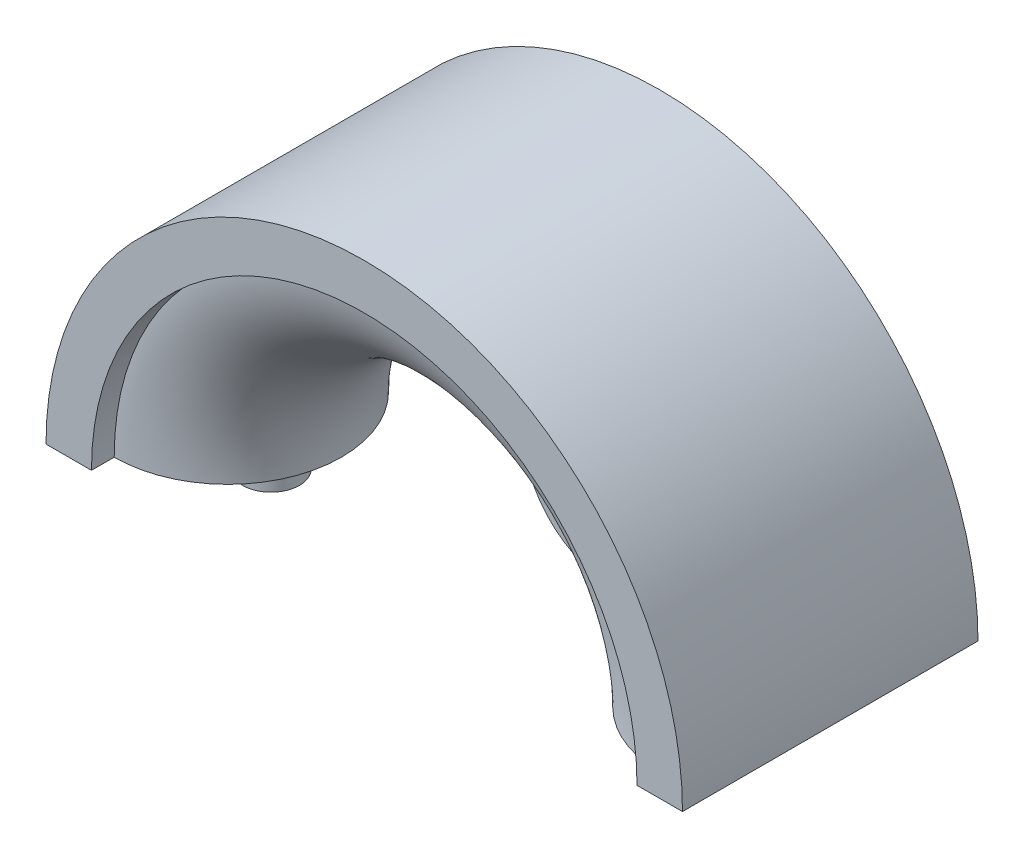
ISO-10303-21;
HEADER;
FILE_DESCRIPTION(('STEP AP214'),'2;1');
FILE_NAME('part.step','',(''),(''),'','','');
FILE_SCHEMA(('AUTOMOTIVE_DESIGN { 1 0 10303 214 1 1 1 1 }'));
ENDSEC;
DATA;
#1=APPLICATION_CONTEXT('core data for automotive mechanical design processes');
#2=APPLICATION_PROTOCOL_DEFINITION('international standard','automotive_design',2000,#1);
#3=PRODUCT_CONTEXT('',#1,'mechanical');
#4=PRODUCT('Part','Part','',(#3));
#5=PRODUCT_RELATED_PRODUCT_CATEGORY('part','',(#4));
#6=PRODUCT_DEFINITION_FORMATION('','',#4);
#7=PRODUCT_DEFINITION_CONTEXT('part definition',#1,'design');
#8=PRODUCT_DEFINITION('design','',#6,#7);
#9=PRODUCT_DEFINITION_SHAPE('','',#8);
#10=(LENGTH_UNIT() NAMED_UNIT(*) SI_UNIT(.MILLI.,.METRE.));
#11=(NAMED_UNIT(*) PLANE_ANGLE_UNIT() SI_UNIT($,.RADIAN.));
#12=(NAMED_UNIT(*) SI_UNIT($,.STERADIAN.) SOLID_ANGLE_UNIT());
#13=UNCERTAINTY_MEASURE_WITH_UNIT(LENGTH_MEASURE(1.E-05),#10,'distance_accuracy_value','');
#14=(GEOMETRIC_REPRESENTATION_CONTEXT(3) GLOBAL_UNCERTAINTY_ASSIGNED_CONTEXT((#13)) GLOBAL_UNIT_ASSIGNED_CONTEXT((#10,
#11,#12)) REPRESENTATION_CONTEXT('',''));
#15=CARTESIAN_POINT('',(0.,0.,0.));
#16=DIRECTION('',(0.,0.,1.));
#17=DIRECTION('',(1.,0.,0.));
#18=AXIS2_PLACEMENT_3D('',#15,#16,#17);
#19=CARTESIAN_POINT('',(0.,0.,0.));
#20=DIRECTION('',(0.,1.,0.));
#21=DIRECTION('',(0.,0.,1.));
#22=AXIS2_PLACEMENT_3D('',#19,#20,#21);
#23=PLANE('',#22);
#24=CARTESIAN_POINT('',(10.1,0.,5.99999999999991));
#25=DIRECTION('',(0.,1.,0.));
#26=DIRECTION('',(0.,0.,1.));
#27=AXIS2_PLACEMENT_3D('',#24,#25,#26);
#28=CIRCLE('',#27,1.25);
#29=CARTESIAN_POINT('',(10.1,0.,7.24999999999991));
#30=VERTEX_POINT('',#29);
#31=EDGE_CURVE('E168',#30,#30,#28,.F.);
#32=ORIENTED_EDGE('',*,*,#31,.F.);
#33=EDGE_LOOP('',(#32));
#34=FACE_BOUND('',#33,.T.);
#35=DIRECTION('',(-1.,0.,0.));
#36=VECTOR('',#35,1.);
#37=CARTESIAN_POINT('',(0.,0.,0.));
#38=LINE('',#37,#36);
#39=CARTESIAN_POINT('',(12.,0.,0.));
#40=VERTEX_POINT('',#39);
#41=CARTESIAN_POINT('',(4.,0.,0.));
#42=VERTEX_POINT('',#41);
#43=EDGE_CURVE('E117',#40,#42,#38,.T.);
#44=ORIENTED_EDGE('',*,*,#43,.T.);
#45=DIRECTION('',(0.,0.,-1.));
#46=VECTOR('',#45,1.);
#47=CARTESIAN_POINT('',(4.,0.,1.));
#48=LINE('',#47,#46);
#49=CARTESIAN_POINT('',(4.,0.,-1.));
#50=VERTEX_POINT('',#49);
#51=EDGE_CURVE('E11',#42,#50,#48,.T.);
#52=ORIENTED_EDGE('',*,*,#51,.T.);
#53=DIRECTION('',(1.,0.,0.));
#54=VECTOR('',#53,1.);
#55=CARTESIAN_POINT('',(-12.,0.,-1.));
#56=LINE('',#55,#54);
#57=CARTESIAN_POINT('',(14.,0.,-1.));
#58=VERTEX_POINT('',#57);
#59=EDGE_CURVE('E104',#50,#58,#56,.T.);
#60=ORIENTED_EDGE('',*,*,#59,.T.);
#61=DIRECTION('',(0.,0.,-1.));
#62=VECTOR('',#61,1.);
#63=CARTESIAN_POINT('',(14.,0.,0.));
#64=LINE('',#63,#62);
#65=CARTESIAN_POINT('',(14.,0.,12.));
#66=VERTEX_POINT('',#65);
#67=EDGE_CURVE('E114',#58,#66,#64,.F.);
#68=ORIENTED_EDGE('',*,*,#67,.T.);
#69=DIRECTION('',(-1.,0.,0.));
#70=VECTOR('',#69,1.);
#71=CARTESIAN_POINT('',(-12.,0.,12.));
#72=LINE('',#71,#70);
#73=CARTESIAN_POINT('',(12.,0.,12.));
#74=VERTEX_POINT('',#73);
#75=EDGE_CURVE('E146',#66,#74,#72,.T.);
#76=ORIENTED_EDGE('',*,*,#75,.T.);
#77=DIRECTION('',(0.,0.,-1.));
#78=VECTOR('',#77,1.);
#79=CARTESIAN_POINT('',(12.,0.,0.));
#80=LINE('',#79,#78);
#81=CARTESIAN_POINT('',(12.0000000000001,0.,10.9999999999999));
#82=VERTEX_POINT('',#81);
#83=EDGE_CURVE('E142',#74,#82,#80,.T.);
#84=ORIENTED_EDGE('',*,*,#83,.T.);
#85=CARTESIAN_POINT('',(12.,0.,5.99999999999991));
#86=DIRECTION('',(0.,1.,0.));
#87=DIRECTION('',(0.,0.,1.));
#88=AXIS2_PLACEMENT_3D('',#85,#86,#87);
#89=CIRCLE('',#88,5.);
#90=CARTESIAN_POINT('',(12.,0.,0.999999999999957));
#91=VERTEX_POINT('',#90);
#92=EDGE_CURVE('E136',#82,#91,#89,.F.);
#93=ORIENTED_EDGE('',*,*,#92,.T.);
#94=DIRECTION('',(0.,0.,-1.));
#95=VECTOR('',#94,1.);
#96=CARTESIAN_POINT('',(12.,0.,0.));
#97=LINE('',#96,#95);
#98=EDGE_CURVE('E134',#91,#40,#97,.T.);
#99=ORIENTED_EDGE('',*,*,#98,.T.);
#100=EDGE_LOOP('',(#44,#52,#60,#68,#76,#84,#93,#99));
#101=FACE_BOUND('',#100,.T.);
#102=ADVANCED_FACE('F39',(#34,#101),#23,.F.);
#103=CARTESIAN_POINT('',(0.,0.,6.));
#104=DIRECTION('',(0.,0.,1.));
#105=DIRECTION('',(0.,-1.,0.));
#106=AXIS2_PLACEMENT_3D('',#103,#104,#105);
#107=TOROIDAL_SURFACE('',#106,12.,5.);
#108=CARTESIAN_POINT('',(-12.,0.,6.00000000000008));
#109=DIRECTION('',(0.,1.,0.));
#110=DIRECTION('',(0.,0.,1.));
#111=AXIS2_PLACEMENT_3D('',#108,#109,#110);
#112=CIRCLE('',#111,5.);
#113=CARTESIAN_POINT('',(-12.,0.,0.999999999999957));
#114=VERTEX_POINT('',#113);
#115=CARTESIAN_POINT('',(-11.9999999999999,0.,11.0000000000001));
#116=VERTEX_POINT('',#115);
#117=EDGE_CURVE('E138',#114,#116,#112,.F.);
#118=ORIENTED_EDGE('',*,*,#117,.F.);
#119=CARTESIAN_POINT('',(0.,0.,0.999999999999999));
#120=DIRECTION('',(0.,0.,1.));
#121=DIRECTION('',(0.,-1.,0.));
#122=AXIS2_PLACEMENT_3D('',#119,#120,#121);
#123=CIRCLE('',#122,12.);
#124=EDGE_CURVE('E160',#91,#114,#123,.T.);
#125=ORIENTED_EDGE('',*,*,#124,.F.);
#126=ORIENTED_EDGE('',*,*,#92,.F.);
#127=CARTESIAN_POINT('',(0.,0.,11.));
#128=DIRECTION('',(0.,0.,-1.));
#129=DIRECTION('',(-1.,0.,0.));
#130=AXIS2_PLACEMENT_3D('',#127,#128,#129);
#131=CIRCLE('',#130,12.);
#132=EDGE_CURVE('E157',#116,#82,#131,.T.);
#133=ORIENTED_EDGE('',*,*,#132,.F.);
#134=EDGE_LOOP('',(#118,#125,#126,#133));
#135=FACE_BOUND('',#134,.T.);
#136=ADVANCED_FACE('F41',(#135),#107,.T.);
#137=CARTESIAN_POINT('',(0.,0.,0.));
#138=DIRECTION('',(0.,0.,-1.));
#139=DIRECTION('',(-1.,0.,0.));
#140=AXIS2_PLACEMENT_3D('',#137,#138,#139);
#141=CYLINDRICAL_SURFACE('',#140,12.);
#142=ORIENTED_EDGE('',*,*,#83,.F.);
#143=CARTESIAN_POINT('',(0.,0.,12.));
#144=DIRECTION('',(0.,0.,-1.));
#145=DIRECTION('',(-1.,0.,0.));
#146=AXIS2_PLACEMENT_3D('',#143,#144,#145);
#147=CIRCLE('',#146,12.);
#148=CARTESIAN_POINT('',(-12.,0.,12.));
#149=VERTEX_POINT('',#148);
#150=EDGE_CURVE('E154',#149,#74,#147,.T.);
#151=ORIENTED_EDGE('',*,*,#150,.F.);
#152=DIRECTION('',(0.,0.,-1.));
#153=VECTOR('',#152,1.);
#154=CARTESIAN_POINT('',(-12.,0.,0.));
#155=LINE('',#154,#153);
#156=EDGE_CURVE('E140',#116,#149,#155,.F.);
#157=ORIENTED_EDGE('',*,*,#156,.F.);
#158=ORIENTED_EDGE('',*,*,#132,.T.);
#159=EDGE_LOOP('',(#142,#151,#157,#158));
#160=FACE_BOUND('',#159,.T.);
#161=ADVANCED_FACE('F194',(#160),#141,.F.);
#162=ORIENTED_EDGE('',*,*,#98,.F.);
#163=ORIENTED_EDGE('',*,*,#124,.T.);
#164=DIRECTION('',(0.,0.,-1.));
#165=VECTOR('',#164,1.);
#166=CARTESIAN_POINT('',(-12.,0.,0.));
#167=LINE('',#166,#165);
#168=CARTESIAN_POINT('',(-12.,0.,0.));
#169=VERTEX_POINT('',#168);
#170=EDGE_CURVE('E130',#169,#114,#167,.F.);
#171=ORIENTED_EDGE('',*,*,#170,.F.);
#172=CARTESIAN_POINT('',(0.,0.,0.));
#173=DIRECTION('',(0.,0.,1.));
#174=DIRECTION('',(1.,0.,0.));
#175=AXIS2_PLACEMENT_3D('',#172,#173,#174);
#176=CIRCLE('',#175,12.);
#177=EDGE_CURVE('E163',#40,#169,#176,.T.);
#178=ORIENTED_EDGE('',*,*,#177,.F.);
#179=EDGE_LOOP('',(#162,#163,#171,#178));
#180=FACE_BOUND('',#179,.T.);
#181=ADVANCED_FACE('F203',(#180),#141,.F.);
#182=CARTESIAN_POINT('',(-12.,0.,12.));
#183=DIRECTION('',(0.,0.,1.));
#184=DIRECTION('',(1.,0.,0.));
#185=AXIS2_PLACEMENT_3D('',#182,#183,#184);
#186=PLANE('',#185);
#187=ORIENTED_EDGE('',*,*,#75,.F.);
#188=CARTESIAN_POINT('',(0.,0.,12.));
#189=DIRECTION('',(0.,0.,-1.));
#190=DIRECTION('',(-1.,0.,0.));
#191=AXIS2_PLACEMENT_3D('',#188,#189,#190);
#192=CIRCLE('',#191,14.);
#193=CARTESIAN_POINT('',(-14.,0.,12.));
#194=VERTEX_POINT('',#193);
#195=EDGE_CURVE('E151',#194,#66,#192,.T.);
#196=ORIENTED_EDGE('',*,*,#195,.F.);
#197=EDGE_CURVE('E144',#149,#194,#72,.T.);
#198=ORIENTED_EDGE('',*,*,#197,.F.);
#199=ORIENTED_EDGE('',*,*,#150,.T.);
#200=EDGE_LOOP('',(#187,#196,#198,#199));
#201=FACE_BOUND('',#200,.T.);
#202=ADVANCED_FACE('F189',(#201),#186,.T.);
#203=CARTESIAN_POINT('',(0.,0.,0.));
#204=DIRECTION('',(0.,0.,-1.));
#205=DIRECTION('',(-1.,0.,0.));
#206=AXIS2_PLACEMENT_3D('',#203,#204,#205);
#207=CYLINDRICAL_SURFACE('',#206,14.);
#208=ORIENTED_EDGE('',*,*,#67,.F.);
#209=CARTESIAN_POINT('',(0.,0.,-1.));
#210=DIRECTION('',(0.,0.,-1.));
#211=DIRECTION('',(-1.,0.,0.));
#212=AXIS2_PLACEMENT_3D('',#209,#210,#211);
#213=CIRCLE('',#212,14.);
#214=CARTESIAN_POINT('',(-14.,0.,-1.));
#215=VERTEX_POINT('',#214);
#216=EDGE_CURVE('E110',#215,#58,#213,.T.);
#217=ORIENTED_EDGE('',*,*,#216,.F.);
#218=DIRECTION('',(0.,0.,-1.));
#219=VECTOR('',#218,1.);
#220=CARTESIAN_POINT('',(-14.,0.,0.));
#221=LINE('',#220,#219);
#222=EDGE_CURVE('E147',#194,#215,#221,.T.);
#223=ORIENTED_EDGE('',*,*,#222,.F.);
#224=ORIENTED_EDGE('',*,*,#195,.T.);
#225=EDGE_LOOP('',(#208,#217,#223,#224));
#226=FACE_BOUND('',#225,.T.);
#227=ADVANCED_FACE('F184',(#226),#207,.T.);
#228=CARTESIAN_POINT('',(-12.,0.,-1.));
#229=DIRECTION('',(0.,0.,-1.));
#230=DIRECTION('',(-1.,0.,0.));
#231=AXIS2_PLACEMENT_3D('',#228,#229,#230);
#232=PLANE('',#231);
#233=ORIENTED_EDGE('',*,*,#59,.F.);
#234=CARTESIAN_POINT('',(0.,0.,-1.));
#235=DIRECTION('',(0.,0.,-1.));
#236=DIRECTION('',(-1.,0.,0.));
#237=AXIS2_PLACEMENT_3D('',#234,#235,#236);
#238=CIRCLE('',#237,4.);
#239=CARTESIAN_POINT('',(-4.,0.,-1.));
#240=VERTEX_POINT('',#239);
#241=EDGE_CURVE('E108',#50,#240,#238,.T.);
#242=ORIENTED_EDGE('',*,*,#241,.T.);
#243=EDGE_CURVE('E113',#215,#240,#56,.T.);
#244=ORIENTED_EDGE('',*,*,#243,.F.);
#245=ORIENTED_EDGE('',*,*,#216,.T.);
#246=EDGE_LOOP('',(#233,#242,#244,#245));
#247=FACE_BOUND('',#246,.T.);
#248=ADVANCED_FACE('F105',(#247),#232,.T.);
#249=CARTESIAN_POINT('',(0.,0.,0.));
#250=DIRECTION('',(0.,0.,1.));
#251=DIRECTION('',(1.,0.,0.));
#252=AXIS2_PLACEMENT_3D('',#249,#250,#251);
#253=PLANE('',#252);
#254=CARTESIAN_POINT('',(0.,0.,0.));
#255=DIRECTION('',(0.,0.,1.));
#256=DIRECTION('',(1.,0.,0.));
#257=AXIS2_PLACEMENT_3D('',#254,#255,#256);
#258=CIRCLE('',#257,4.);
#259=CARTESIAN_POINT('',(-4.,0.,0.));
#260=VERTEX_POINT('',#259);
#261=EDGE_CURVE('E60',#42,#260,#258,.T.);
#262=ORIENTED_EDGE('',*,*,#261,.F.);
#263=ORIENTED_EDGE('',*,*,#43,.F.);
#264=ORIENTED_EDGE('',*,*,#177,.T.);
#265=EDGE_CURVE('E166',#260,#169,#38,.T.);
#266=ORIENTED_EDGE('',*,*,#265,.F.);
#267=EDGE_LOOP('',(#262,#263,#264,#266));
#268=FACE_BOUND('',#267,.T.);
#269=ADVANCED_FACE('F180',(#268),#253,.T.);
#270=CARTESIAN_POINT('',(-10.1,0.,5.99999999999991));
#271=DIRECTION('',(0.,1.,0.));
#272=DIRECTION('',(0.,0.,1.));
#273=AXIS2_PLACEMENT_3D('',#270,#271,#272);
#274=CIRCLE('',#273,1.25);
#275=CARTESIAN_POINT('',(-10.1,0.,7.24999999999991));
#276=VERTEX_POINT('',#275);
#277=EDGE_CURVE('E171',#276,#276,#274,.F.);
#278=ORIENTED_EDGE('',*,*,#277,.F.);
#279=EDGE_LOOP('',(#278));
#280=FACE_BOUND('',#279,.T.);
#281=ORIENTED_EDGE('',*,*,#243,.T.);
#282=DIRECTION('',(0.,0.,-1.));
#283=VECTOR('',#282,1.);
#284=CARTESIAN_POINT('',(-4.,0.,1.));
#285=LINE('',#284,#283);
#286=EDGE_CURVE('E47',#240,#260,#285,.F.);
#287=ORIENTED_EDGE('',*,*,#286,.T.);
#288=ORIENTED_EDGE('',*,*,#265,.T.);
#289=ORIENTED_EDGE('',*,*,#170,.T.);
#290=ORIENTED_EDGE('',*,*,#117,.T.);
#291=ORIENTED_EDGE('',*,*,#156,.T.);
#292=ORIENTED_EDGE('',*,*,#197,.T.);
#293=ORIENTED_EDGE('',*,*,#222,.T.);
#294=EDGE_LOOP('',(#281,#287,#288,#289,#290,#291,#292,#293));
#295=FACE_BOUND('',#294,.T.);
#296=ADVANCED_FACE('F177',(#280,#295),#23,.F.);
#297=CARTESIAN_POINT('',(10.1,-2.,5.99999999999991));
#298=DIRECTION('',(0.,1.,0.));
#299=DIRECTION('',(0.,0.,1.));
#300=AXIS2_PLACEMENT_3D('',#297,#298,#299);
#301=CYLINDRICAL_SURFACE('',#300,1.25);
#302=CARTESIAN_POINT('',(10.1,-2.,5.99999999999991));
#303=DIRECTION('',(0.,-1.,0.));
#304=DIRECTION('',(0.,0.,-1.));
#305=AXIS2_PLACEMENT_3D('',#302,#303,#304);
#306=CIRCLE('',#305,1.25);
#307=CARTESIAN_POINT('',(10.1,-2.,4.74999999999991));
#308=VERTEX_POINT('',#307);
#309=EDGE_CURVE('E126',#308,#308,#306,.T.);
#310=ORIENTED_EDGE('',*,*,#309,.F.);
#311=EDGE_LOOP('',(#310));
#312=FACE_BOUND('',#311,.T.);
#313=ORIENTED_EDGE('',*,*,#31,.T.);
#314=EDGE_LOOP('',(#313));
#315=FACE_BOUND('',#314,.T.);
#316=ADVANCED_FACE('F179',(#312,#315),#301,.T.);
#317=CARTESIAN_POINT('',(10.1,-2.,5.99999999999991));
#318=DIRECTION('',(0.,-1.,0.));
#319=DIRECTION('',(0.,0.,-1.));
#320=AXIS2_PLACEMENT_3D('',#317,#318,#319);
#321=PLANE('',#320);
#322=ORIENTED_EDGE('',*,*,#309,.T.);
#323=EDGE_LOOP('',(#322));
#324=FACE_BOUND('',#323,.T.);
#325=ADVANCED_FACE('F219',(#324),#321,.T.);
#326=CARTESIAN_POINT('',(-10.1,-2.,5.99999999999991));
#327=DIRECTION('',(0.,1.,0.));
#328=DIRECTION('',(0.,0.,1.));
#329=AXIS2_PLACEMENT_3D('',#326,#327,#328);
#330=CYLINDRICAL_SURFACE('',#329,1.25);
#331=CARTESIAN_POINT('',(-10.1,-2.,5.99999999999991));
#332=DIRECTION('',(0.,-1.,0.));
#333=DIRECTION('',(0.,0.,-1.));
#334=AXIS2_PLACEMENT_3D('',#331,#332,#333);
#335=CIRCLE('',#334,1.25);
#336=CARTESIAN_POINT('',(-10.1,-2.,4.74999999999991));
#337=VERTEX_POINT('',#336);
#338=EDGE_CURVE('E127',#337,#337,#335,.T.);
#339=ORIENTED_EDGE('',*,*,#338,.F.);
#340=EDGE_LOOP('',(#339));
#341=FACE_BOUND('',#340,.T.);
#342=ORIENTED_EDGE('',*,*,#277,.T.);
#343=EDGE_LOOP('',(#342));
#344=FACE_BOUND('',#343,.T.);
#345=ADVANCED_FACE('F175',(#341,#344),#330,.T.);
#346=CARTESIAN_POINT('',(-10.1,-2.,5.99999999999991));
#347=DIRECTION('',(0.,-1.,0.));
#348=DIRECTION('',(0.,0.,-1.));
#349=AXIS2_PLACEMENT_3D('',#346,#347,#348);
#350=PLANE('',#349);
#351=ORIENTED_EDGE('',*,*,#338,.T.);
#352=EDGE_LOOP('',(#351));
#353=FACE_BOUND('',#352,.T.);
#354=ADVANCED_FACE('F228',(#353),#350,.T.);
#355=CARTESIAN_POINT('',(0.,0.,1.));
#356=DIRECTION('',(0.,0.,-1.));
#357=DIRECTION('',(-1.,0.,0.));
#358=AXIS2_PLACEMENT_3D('',#355,#356,#357);
#359=CYLINDRICAL_SURFACE('',#358,4.);
#360=CARTESIAN_POINT('',(0.,0.,1.));
#361=DIRECTION('',(0.,0.,-1.));
#362=DIRECTION('',(-1.,0.,0.));
#363=AXIS2_PLACEMENT_3D('',#360,#361,#362);
#364=CIRCLE('',#363,4.);
#365=CARTESIAN_POINT('',(-4.,0.,1.));
#366=VERTEX_POINT('',#365);
#367=EDGE_CURVE('E120',#366,#366,#364,.T.);
#368=ORIENTED_EDGE('',*,*,#367,.T.);
#369=EDGE_LOOP('',(#368));
#370=FACE_BOUND('',#369,.T.);
#371=ORIENTED_EDGE('',*,*,#51,.F.);
#372=ORIENTED_EDGE('',*,*,#261,.T.);
#373=ORIENTED_EDGE('',*,*,#286,.F.);
#374=ORIENTED_EDGE('',*,*,#241,.F.);
#375=EDGE_LOOP('',(#371,#372,#373,#374));
#376=FACE_BOUND('',#375,.T.);
#377=ADVANCED_FACE('F119',(#370,#376),#359,.T.);
#378=CARTESIAN_POINT('',(0.,0.,1.));
#379=DIRECTION('',(0.,0.,-1.));
#380=DIRECTION('',(-1.,0.,0.));
#381=AXIS2_PLACEMENT_3D('',#378,#379,#380);
#382=PLANE('',#381);
#383=ORIENTED_EDGE('',*,*,#367,.F.);
#384=EDGE_LOOP('',(#383));
#385=FACE_BOUND('',#384,.T.);
#386=ADVANCED_FACE('F234',(#385),#382,.F.);
#387=CLOSED_SHELL('',(#102,#136,#161,#181,#202,#227,#248,#269,#296,#316,#325,#345,#354,#377,#386));
#388=MANIFOLD_SOLID_BREP('B2',#387);
#389=ADVANCED_BREP_SHAPE_REPRESENTATION('',(#18,#388),#14);
#390=SHAPE_DEFINITION_REPRESENTATION(#9,#389);
ENDSEC;
END-ISO-10303-21;
